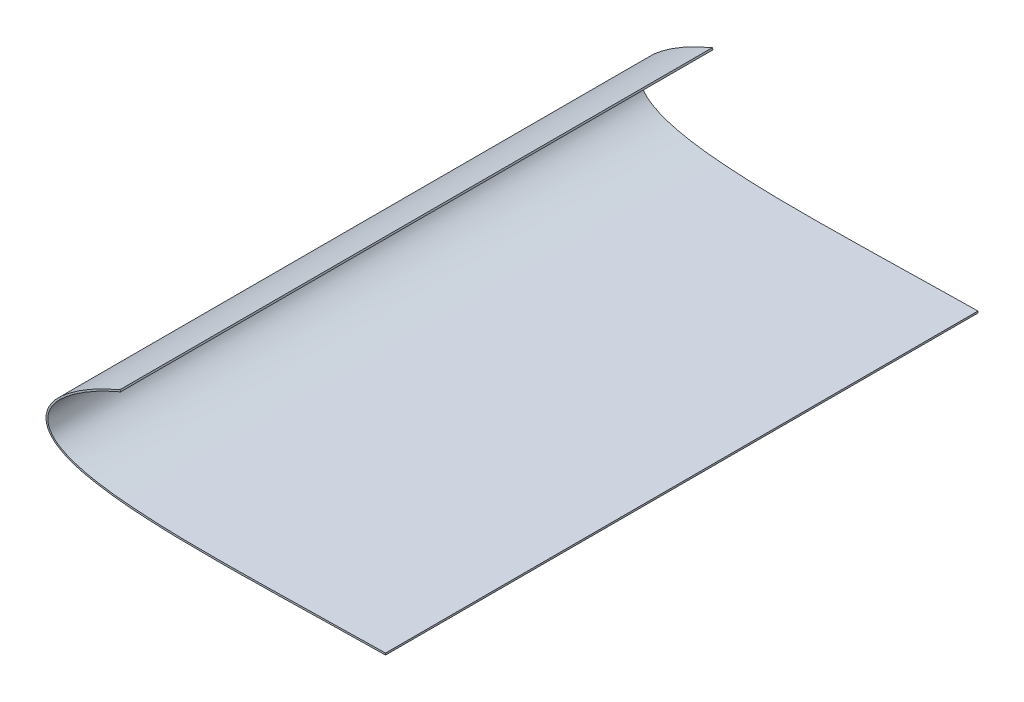
ISO-10303-21;
HEADER;
FILE_DESCRIPTION(('STEP AP214'),'2;1');
FILE_NAME('part.step','',(''),(''),'','','');
FILE_SCHEMA(('AUTOMOTIVE_DESIGN { 1 0 10303 214 1 1 1 1 }'));
ENDSEC;
DATA;
#1=APPLICATION_CONTEXT('core data for automotive mechanical design processes');
#2=APPLICATION_PROTOCOL_DEFINITION('international standard','automotive_design',2000,#1);
#3=PRODUCT_CONTEXT('',#1,'mechanical');
#4=PRODUCT('Part','Part','',(#3));
#5=PRODUCT_RELATED_PRODUCT_CATEGORY('part','',(#4));
#6=PRODUCT_DEFINITION_FORMATION('','',#4);
#7=PRODUCT_DEFINITION_CONTEXT('part definition',#1,'design');
#8=PRODUCT_DEFINITION('design','',#6,#7);
#9=PRODUCT_DEFINITION_SHAPE('','',#8);
#10=(LENGTH_UNIT() NAMED_UNIT(*) SI_UNIT(.MILLI.,.METRE.));
#11=(NAMED_UNIT(*) PLANE_ANGLE_UNIT() SI_UNIT($,.RADIAN.));
#12=(NAMED_UNIT(*) SI_UNIT($,.STERADIAN.) SOLID_ANGLE_UNIT());
#13=UNCERTAINTY_MEASURE_WITH_UNIT(LENGTH_MEASURE(1.E-05),#10,'distance_accuracy_value','');
#14=(GEOMETRIC_REPRESENTATION_CONTEXT(3) GLOBAL_UNCERTAINTY_ASSIGNED_CONTEXT((#13)) GLOBAL_UNIT_ASSIGNED_CONTEXT((#10,
#11,#12)) REPRESENTATION_CONTEXT('',''));
#15=CARTESIAN_POINT('',(0.,0.,0.));
#16=DIRECTION('',(0.,0.,1.));
#17=DIRECTION('',(1.,0.,0.));
#18=AXIS2_PLACEMENT_3D('',#15,#16,#17);
#19=CARTESIAN_POINT('',(52.279784263396,54.6368495583963,-174.625));
#20=CARTESIAN_POINT('',(51.9842375839482,54.5110568205723,-174.625));
#21=CARTESIAN_POINT('',(50.7698703349108,53.9873361103405,-174.625));
#22=CARTESIAN_POINT('',(48.7262842208841,53.0365372041149,-174.625));
#23=CARTESIAN_POINT('',(46.1985966340727,51.7856149808949,-174.625));
#24=CARTESIAN_POINT('',(43.8513955335234,50.5628357336957,-174.625));
#25=CARTESIAN_POINT('',(41.7065223147171,49.2753909988389,-174.625));
#26=CARTESIAN_POINT('',(39.733394775625,48.0292859809215,-174.625));
#27=CARTESIAN_POINT('',(37.9660150500307,46.7508633129765,-174.625));
#28=CARTESIAN_POINT('',(36.3542569420481,45.5542620285061,-174.625));
#29=CARTESIAN_POINT('',(34.9506042386984,44.3247206516308,-174.625));
#30=CARTESIAN_POINT('',(33.7310058534112,43.1375529445579,-174.625));
#31=CARTESIAN_POINT('',(32.6875400615619,41.9646967740159,-174.625));
#32=CARTESIAN_POINT('',(31.8700494946095,40.7950980760292,-174.625));
#33=CARTESIAN_POINT('',(31.2049081040977,39.6569207752362,-174.625));
#34=CARTESIAN_POINT('',(30.8086033681005,38.5196104238674,-174.625));
#35=CARTESIAN_POINT('',(30.5235691356459,37.4345389132446,-174.625));
#36=CARTESIAN_POINT('',(30.4310087825791,36.3627840788217,-174.625));
#37=CARTESIAN_POINT('',(30.615024145006,35.32934754233,-174.625));
#38=CARTESIAN_POINT('',(30.8927865257014,34.3177616701598,-174.625));
#39=CARTESIAN_POINT('',(31.4496102095806,33.3932258153343,-174.625));
#40=CARTESIAN_POINT('',(32.1506525347102,32.5234150336729,-174.625));
#41=CARTESIAN_POINT('',(32.9766589610015,31.6506119978175,-174.625));
#42=CARTESIAN_POINT('',(34.0717450313561,30.9441424330286,-174.625));
#43=CARTESIAN_POINT('',(35.2743301471047,30.2147424818531,-174.625));
#44=CARTESIAN_POINT('',(36.6606910218293,29.5585884336969,-174.625));
#45=CARTESIAN_POINT('',(38.2298639762326,28.9795874382233,-174.625));
#46=CARTESIAN_POINT('',(39.9603274946295,28.409153359317,-174.625));
#47=CARTESIAN_POINT('',(41.862111381165,27.9076892579437,-174.625));
#48=CARTESIAN_POINT('',(43.9308294935862,27.4768136073615,-174.625));
#49=CARTESIAN_POINT('',(46.1430586763678,27.0544798825399,-174.625));
#50=CARTESIAN_POINT('',(48.5261088087182,26.711860726111,-174.625));
#51=CARTESIAN_POINT('',(51.0445678607058,26.3949027035553,-174.625));
#52=CARTESIAN_POINT('',(53.7226630674446,26.06649037235,-174.625));
#53=CARTESIAN_POINT('',(56.5512320841555,25.9162004583246,-174.625));
#54=CARTESIAN_POINT('',(59.5207885191564,25.6696578391719,-174.625));
#55=CARTESIAN_POINT('',(62.6352898997253,25.564258659258,-174.625));
#56=CARTESIAN_POINT('',(65.8829117322227,25.3781107864141,-174.625));
#57=CARTESIAN_POINT('',(69.2727213948618,25.3117021246645,-174.625));
#58=CARTESIAN_POINT('',(72.7875926931949,25.2447227423576,-174.625));
#59=CARTESIAN_POINT('',(76.4410168529708,25.2177536800816,-174.625));
#60=CARTESIAN_POINT('',(80.2079561151313,25.2059255566866,-174.625));
#61=CARTESIAN_POINT('',(84.0995890603195,25.2542808010686,-174.625));
#62=CARTESIAN_POINT('',(88.093376992889,25.2344045238007,-174.625));
#63=CARTESIAN_POINT('',(92.2094832757753,25.3673234412305,-174.625));
#64=CARTESIAN_POINT('',(96.427933938967,25.3704722092847,-174.625));
#65=CARTESIAN_POINT('',(100.757397226996,25.4491366982306,-174.625));
#66=CARTESIAN_POINT('',(105.17451648858,25.5547340767129,-174.625));
#67=CARTESIAN_POINT('',(109.691566336199,25.6470871193837,-174.625));
#68=CARTESIAN_POINT('',(114.294867366389,25.7362480016773,-174.625));
#69=CARTESIAN_POINT('',(118.998236922616,25.8022193393076,-174.625));
#70=CARTESIAN_POINT('',(123.786466612625,25.9376003922086,-174.625));
#71=CARTESIAN_POINT('',(127.652050322274,25.978617474138,-174.625));
#72=CARTESIAN_POINT('',(129.916088327162,26.0062875546644,-174.625));
#73=CARTESIAN_POINT('',(130.555209424101,26.0143218854273,-174.625));
#74=B_SPLINE_CURVE_WITH_KNOTS('',3,(#19,#20,#21,#22,#23,#24,#25,#26,#27,#28,#29,#30,#31,#32,#33,
#34,#35,#36,#37,#38,#39,#40,#41,#42,#43,#44,#45,#46,#47,#48,#49,#50,#51,#52,#53,#54,#55,#56,#57,
#58,#59,#60,#61,#62,#63,#64,#65,#66,#67,#68,#69,#70,#71,#72,#73),.UNSPECIFIED.,.F.,.F.,(4,1,1,1,
1,1,1,1,1,1,1,1,1,1,1,1,1,1,1,1,1,1,1,1,1,1,1,1,1,1,1,1,1,1,1,1,1,1,1,1,1,1,1,1,1,1,1,1,1,1,1,1,
4),(14.1344292083141,14.1723678306515,14.2906368426527,14.4005642750807,14.5054914593558,
14.6030933056501,14.6959497647682,14.7810065128842,14.8606668744199,14.932933187457,
15.0011950186659,15.0616397239758,15.1179775656103,15.1695757089876,15.2167045451708,
15.2596692469617,15.3020092469619,15.3423908516848,15.383061745454,15.4251745843519,
15.4685835050936,15.5151435437538,15.5662226823522,15.6217218895538,15.681367848344,
15.7469541944843,15.8191910050454,15.8965021064469,15.9790921784904,16.0687366540585,
16.162461376517,16.2633705099003,16.3685817203289,16.4810017203293,16.59780172033,
16.7204764773092,16.848989654843,16.9819779445536,17.1208699169633,17.2642178294,
17.4134881037355,17.5657766719204,17.7238886727302,17.8851509435814,18.0521088221016,
18.2220969675706,18.3965776576198,18.5739661555559,18.7557170983324,18.9403767994038,
19.1295299278471,19.3214630182723,19.3969558554318),.UNSPECIFIED.);
#75=DIRECTION('',(0.,0.,1.));
#76=VECTOR('',#75,1.);
#77=SURFACE_OF_LINEAR_EXTRUSION('',#74,#76);
#78=CARTESIAN_POINT('',(52.279784263396,54.6368495583963,0.));
#79=CARTESIAN_POINT('',(51.9842375839482,54.5110568205723,0.));
#80=CARTESIAN_POINT('',(50.7698703349108,53.9873361103405,0.));
#81=CARTESIAN_POINT('',(48.7262842208841,53.0365372041149,0.));
#82=CARTESIAN_POINT('',(46.1985966340727,51.7856149808949,0.));
#83=CARTESIAN_POINT('',(43.8513955335234,50.5628357336957,0.));
#84=CARTESIAN_POINT('',(41.7065223147171,49.2753909988389,0.));
#85=CARTESIAN_POINT('',(39.733394775625,48.0292859809215,0.));
#86=CARTESIAN_POINT('',(37.9660150500307,46.7508633129765,0.));
#87=CARTESIAN_POINT('',(36.3542569420481,45.5542620285061,0.));
#88=CARTESIAN_POINT('',(34.9506042386984,44.3247206516308,0.));
#89=CARTESIAN_POINT('',(33.7310058534112,43.1375529445579,0.));
#90=CARTESIAN_POINT('',(32.6875400615619,41.9646967740159,0.));
#91=CARTESIAN_POINT('',(31.8700494946095,40.7950980760292,0.));
#92=CARTESIAN_POINT('',(31.2049081040977,39.6569207752362,0.));
#93=CARTESIAN_POINT('',(30.8086033681005,38.5196104238674,0.));
#94=CARTESIAN_POINT('',(30.5235691356459,37.4345389132446,0.));
#95=CARTESIAN_POINT('',(30.4310087825791,36.3627840788217,0.));
#96=CARTESIAN_POINT('',(30.615024145006,35.32934754233,0.));
#97=CARTESIAN_POINT('',(30.8927865257014,34.3177616701598,0.));
#98=CARTESIAN_POINT('',(31.4496102095806,33.3932258153343,0.));
#99=CARTESIAN_POINT('',(32.1506525347102,32.5234150336729,0.));
#100=CARTESIAN_POINT('',(32.9766589610015,31.6506119978175,0.));
#101=CARTESIAN_POINT('',(34.0717450313561,30.9441424330286,0.));
#102=CARTESIAN_POINT('',(35.2743301471047,30.2147424818531,0.));
#103=CARTESIAN_POINT('',(36.6606910218293,29.5585884336969,0.));
#104=CARTESIAN_POINT('',(38.2298639762326,28.9795874382233,0.));
#105=CARTESIAN_POINT('',(39.9603274946295,28.409153359317,0.));
#106=CARTESIAN_POINT('',(41.862111381165,27.9076892579437,0.));
#107=CARTESIAN_POINT('',(43.9308294935862,27.4768136073615,0.));
#108=CARTESIAN_POINT('',(46.1430586763678,27.0544798825399,0.));
#109=CARTESIAN_POINT('',(48.5261088087182,26.711860726111,0.));
#110=CARTESIAN_POINT('',(51.0445678607058,26.3949027035553,0.));
#111=CARTESIAN_POINT('',(53.7226630674446,26.06649037235,0.));
#112=CARTESIAN_POINT('',(56.5512320841555,25.9162004583246,0.));
#113=CARTESIAN_POINT('',(59.5207885191564,25.6696578391719,0.));
#114=CARTESIAN_POINT('',(62.6352898997253,25.564258659258,0.));
#115=CARTESIAN_POINT('',(65.8829117322227,25.3781107864141,0.));
#116=CARTESIAN_POINT('',(69.2727213948618,25.3117021246645,0.));
#117=CARTESIAN_POINT('',(72.7875926931949,25.2447227423576,0.));
#118=CARTESIAN_POINT('',(76.4410168529708,25.2177536800816,0.));
#119=CARTESIAN_POINT('',(80.2079561151313,25.2059255566866,0.));
#120=CARTESIAN_POINT('',(84.0995890603195,25.2542808010686,0.));
#121=CARTESIAN_POINT('',(88.093376992889,25.2344045238007,0.));
#122=CARTESIAN_POINT('',(92.2094832757753,25.3673234412305,0.));
#123=CARTESIAN_POINT('',(96.427933938967,25.3704722092847,0.));
#124=CARTESIAN_POINT('',(100.757397226996,25.4491366982306,0.));
#125=CARTESIAN_POINT('',(105.17451648858,25.5547340767129,0.));
#126=CARTESIAN_POINT('',(109.691566336199,25.6470871193837,0.));
#127=CARTESIAN_POINT('',(114.294867366389,25.7362480016773,0.));
#128=CARTESIAN_POINT('',(118.998236922616,25.8022193393076,0.));
#129=CARTESIAN_POINT('',(123.786466612625,25.9376003922086,0.));
#130=CARTESIAN_POINT('',(127.652050322274,25.978617474138,0.));
#131=CARTESIAN_POINT('',(129.916088327162,26.0062875546644,0.));
#132=CARTESIAN_POINT('',(130.555209424101,26.0143218854273,0.));
#133=B_SPLINE_CURVE_WITH_KNOTS('',3,(#78,#79,#80,#81,#82,#83,#84,#85,#86,#87,#88,#89,#90,#91,
#92,#93,#94,#95,#96,#97,#98,#99,#100,#101,#102,#103,#104,#105,#106,#107,#108,#109,#110,#111,
#112,#113,#114,#115,#116,#117,#118,#119,#120,#121,#122,#123,#124,#125,#126,#127,#128,#129,#130,
#131,#132),.UNSPECIFIED.,.F.,.F.,(4,1,1,1,1,1,1,1,1,1,1,1,1,1,1,1,1,1,1,1,1,1,1,1,1,1,1,1,1,1,1,
1,1,1,1,1,1,1,1,1,1,1,1,1,1,1,1,1,1,1,1,1,4),(14.1344292083141,14.1723678306515,
14.2906368426527,14.4005642750807,14.5054914593558,14.6030933056501,14.6959497647682,
14.7810065128842,14.8606668744199,14.932933187457,15.0011950186659,15.0616397239758,
15.1179775656103,15.1695757089876,15.2167045451708,15.2596692469617,15.3020092469619,
15.3423908516848,15.383061745454,15.4251745843519,15.4685835050936,15.5151435437538,
15.5662226823522,15.6217218895538,15.681367848344,15.7469541944843,15.8191910050454,
15.8965021064469,15.9790921784904,16.0687366540585,16.162461376517,16.2633705099003,
16.3685817203289,16.4810017203293,16.59780172033,16.7204764773092,16.848989654843,
16.9819779445536,17.1208699169633,17.2642178294,17.4134881037355,17.5657766719204,
17.7238886727302,17.8851509435814,18.0521088221016,18.2220969675706,18.3965776576198,
18.5739661555559,18.7557170983324,18.9403767994038,19.1295299278471,19.3214630182723,
19.3969558554318),.UNSPECIFIED.);
#134=CARTESIAN_POINT('',(52.279784263396,54.6368495583963,0.));
#135=VERTEX_POINT('',#134);
#136=CARTESIAN_POINT('',(130.555209424101,26.0143218854273,0.));
#137=VERTEX_POINT('',#136);
#138=EDGE_CURVE('E119',#135,#137,#133,.T.);
#139=ORIENTED_EDGE('',*,*,#138,.F.);
#140=DIRECTION('',(0.,0.,1.));
#141=VECTOR('',#140,1.);
#142=CARTESIAN_POINT('',(52.279784263396,54.6368495583963,-174.625));
#143=LINE('',#142,#141);
#144=CARTESIAN_POINT('',(52.279784263396,54.6368495583963,-174.625));
#145=VERTEX_POINT('',#144);
#146=EDGE_CURVE('E120',#145,#135,#143,.T.);
#147=ORIENTED_EDGE('',*,*,#146,.F.);
#148=CARTESIAN_POINT('',(130.555209424101,26.0143218854273,-174.625));
#149=VERTEX_POINT('',#148);
#150=EDGE_CURVE('E92',#145,#149,#74,.T.);
#151=ORIENTED_EDGE('',*,*,#150,.T.);
#152=DIRECTION('',(0.,0.,1.));
#153=VECTOR('',#152,1.);
#154=CARTESIAN_POINT('',(130.555209424101,26.0143218854273,-174.625));
#155=LINE('',#154,#153);
#156=EDGE_CURVE('E11',#149,#137,#155,.T.);
#157=ORIENTED_EDGE('',*,*,#156,.T.);
#158=EDGE_LOOP('',(#139,#147,#151,#157));
#159=FACE_BOUND('',#158,.T.);
#160=ADVANCED_FACE('F34',(#159),#77,.T.);
#161=CARTESIAN_POINT('',(130.548667937939,26.5346890341615,-174.625));
#162=DIRECTION('',(-0.999920995533172,-0.0125699121695554,0.));
#163=DIRECTION('',(0.0125699121695555,-0.999920995533172,0.));
#164=AXIS2_PLACEMENT_3D('',#161,#162,#163);
#165=PLANE('',#164);
#166=DIRECTION('',(-0.0125699121695554,0.999920995533172,0.));
#167=VECTOR('',#166,1.);
#168=CARTESIAN_POINT('',(130.548667937939,26.5346890341615,0.));
#169=LINE('',#168,#167);
#170=CARTESIAN_POINT('',(130.548667937939,26.5346890341615,0.));
#171=VERTEX_POINT('',#170);
#172=EDGE_CURVE('E121',#137,#171,#169,.T.);
#173=ORIENTED_EDGE('',*,*,#172,.F.);
#174=ORIENTED_EDGE('',*,*,#156,.F.);
#175=DIRECTION('',(-0.0125699121695554,0.999920995533172,0.));
#176=VECTOR('',#175,1.);
#177=CARTESIAN_POINT('',(130.548667937939,26.5346890341615,-174.625));
#178=LINE('',#177,#176);
#179=CARTESIAN_POINT('',(130.548667937939,26.5346890341615,-174.625));
#180=VERTEX_POINT('',#179);
#181=EDGE_CURVE('E76',#149,#180,#178,.T.);
#182=ORIENTED_EDGE('',*,*,#181,.T.);
#183=DIRECTION('',(0.,0.,1.));
#184=VECTOR('',#183,1.);
#185=CARTESIAN_POINT('',(130.548667937939,26.5346890341615,-174.625));
#186=LINE('',#185,#184);
#187=EDGE_CURVE('E43',#180,#171,#186,.T.);
#188=ORIENTED_EDGE('',*,*,#187,.T.);
#189=EDGE_LOOP('',(#173,#174,#182,#188));
#190=FACE_BOUND('',#189,.T.);
#191=ADVANCED_FACE('F90',(#190),#165,.F.);
#192=CARTESIAN_POINT('',(130.548667937939,26.5346890341615,-174.625));
#193=CARTESIAN_POINT('',(124.555343756834,26.4491026396697,-174.625));
#194=CARTESIAN_POINT('',(118.563284111257,26.3143159513226,-174.625));
#195=CARTESIAN_POINT('',(102.663997770162,26.0308132515019,-174.625));
#196=CARTESIAN_POINT('',(92.7642170680979,25.8004249943056,-174.625));
#197=CARTESIAN_POINT('',(77.9969063518174,25.7164614683827,-174.625));
#198=CARTESIAN_POINT('',(73.1544000856876,25.7277180879495,-174.625));
#199=CARTESIAN_POINT('',(63.4698219147655,25.9577443343307,-174.625));
#200=CARTESIAN_POINT('',(58.6332063621148,26.2110915671319,-174.625));
#201=CARTESIAN_POINT('',(51.4046880593991,26.8525814791273,-174.625));
#202=CARTESIAN_POINT('',(49.0055614718312,27.1183583047564,-174.625));
#203=CARTESIAN_POINT('',(44.2531218048478,27.8939248842433,-174.625));
#204=CARTESIAN_POINT('',(41.8889325759947,28.3539185666942,-174.625));
#205=CARTESIAN_POINT('',(38.5092631099543,29.4115926421441,-174.625));
#206=CARTESIAN_POINT('',(37.4227007969777,29.7823005654821,-174.625));
#207=CARTESIAN_POINT('',(35.3858591876671,30.721401098096,-174.625));
#208=CARTESIAN_POINT('',(34.3648285070924,31.2789602327156,-174.625));
#209=CARTESIAN_POINT('',(32.4947462546347,32.7613334870106,-174.625));
#210=CARTESIAN_POINT('',(31.6368907574047,33.8105567726051,-174.625));
#211=CARTESIAN_POINT('',(30.8417084343807,36.1863154881374,-174.625));
#212=CARTESIAN_POINT('',(30.9740163157737,37.4872010536399,-174.625));
#213=CARTESIAN_POINT('',(32.1505911551316,40.6939371356345,-174.625));
#214=CARTESIAN_POINT('',(33.6489329297031,42.4217978213159,-174.625));
#215=CARTESIAN_POINT('',(37.2937741895299,45.7686663906626,-174.625));
#216=CARTESIAN_POINT('',(39.569261895129,47.3620885973542,-174.625));
#217=CARTESIAN_POINT('',(45.1489216631899,50.7908001205631,-174.625));
#218=CARTESIAN_POINT('',(48.5985134973385,52.4662096211677,-174.625));
#219=CARTESIAN_POINT('',(52.2115751343648,54.0523162100325,-174.625));
#220=CARTESIAN_POINT('',(52.3312267033242,54.1046027201561,-174.625));
#221=CARTESIAN_POINT('',(52.4509665908119,54.1566903924833,-174.625));
#222=B_SPLINE_CURVE_WITH_KNOTS('',3,(#192,#193,#194,#195,#196,#197,#198,#199,#200,#201,#202,
#203,#204,#205,#206,#207,#208,#209,#210,#211,#212,#213,#214,#215,#216,#217,#218,#219,#220,#221),
.UNSPECIFIED.,.F.,.F.,(4,2,2,2,2,2,2,2,2,2,2,2,2,2,4),(14.135708649313,14.8434402693259,
16.0140470282882,16.5870564413242,17.1600658543601,17.446570560878,17.733075267396,
17.8698354280187,18.0065955886415,18.1697632211686,18.3329308536956,18.6002796477227,
18.9285117511339,19.3814841253363,19.3969867417204),.UNSPECIFIED.);
#223=DIRECTION('',(0.,0.,1.));
#224=VECTOR('',#223,1.);
#225=SURFACE_OF_LINEAR_EXTRUSION('',#222,#224);
#226=CARTESIAN_POINT('',(130.548667937939,26.5346890341615,0.));
#227=CARTESIAN_POINT('',(124.555343756834,26.4491026396697,0.));
#228=CARTESIAN_POINT('',(118.563284111257,26.3143159513226,0.));
#229=CARTESIAN_POINT('',(102.663997770162,26.0308132515019,0.));
#230=CARTESIAN_POINT('',(92.7642170680979,25.8004249943056,0.));
#231=CARTESIAN_POINT('',(77.9969063518174,25.7164614683827,0.));
#232=CARTESIAN_POINT('',(73.1544000856876,25.7277180879495,0.));
#233=CARTESIAN_POINT('',(63.4698219147655,25.9577443343307,0.));
#234=CARTESIAN_POINT('',(58.6332063621148,26.2110915671319,0.));
#235=CARTESIAN_POINT('',(51.4046880593991,26.8525814791273,0.));
#236=CARTESIAN_POINT('',(49.0055614718312,27.1183583047564,0.));
#237=CARTESIAN_POINT('',(44.2531218048478,27.8939248842433,0.));
#238=CARTESIAN_POINT('',(41.8889325759947,28.3539185666942,0.));
#239=CARTESIAN_POINT('',(38.5092631099543,29.4115926421441,0.));
#240=CARTESIAN_POINT('',(37.4227007969777,29.7823005654821,0.));
#241=CARTESIAN_POINT('',(35.3858591876671,30.721401098096,0.));
#242=CARTESIAN_POINT('',(34.3648285070924,31.2789602327156,0.));
#243=CARTESIAN_POINT('',(32.4947462546347,32.7613334870106,0.));
#244=CARTESIAN_POINT('',(31.6368907574047,33.8105567726051,0.));
#245=CARTESIAN_POINT('',(30.8417084343807,36.1863154881374,0.));
#246=CARTESIAN_POINT('',(30.9740163157737,37.4872010536399,0.));
#247=CARTESIAN_POINT('',(32.1505911551316,40.6939371356345,0.));
#248=CARTESIAN_POINT('',(33.6489329297031,42.4217978213159,0.));
#249=CARTESIAN_POINT('',(37.2937741895299,45.7686663906626,0.));
#250=CARTESIAN_POINT('',(39.569261895129,47.3620885973542,0.));
#251=CARTESIAN_POINT('',(45.1489216631899,50.7908001205631,0.));
#252=CARTESIAN_POINT('',(48.5985134973385,52.4662096211677,0.));
#253=CARTESIAN_POINT('',(52.2115751343648,54.0523162100325,0.));
#254=CARTESIAN_POINT('',(52.3312267033242,54.1046027201561,0.));
#255=CARTESIAN_POINT('',(52.4509665908119,54.1566903924833,0.));
#256=B_SPLINE_CURVE_WITH_KNOTS('',3,(#226,#227,#228,#229,#230,#231,#232,#233,#234,#235,#236,
#237,#238,#239,#240,#241,#242,#243,#244,#245,#246,#247,#248,#249,#250,#251,#252,#253,#254,#255),
.UNSPECIFIED.,.F.,.F.,(4,2,2,2,2,2,2,2,2,2,2,2,2,2,4),(14.135708649313,14.8434402693259,
16.0140470282882,16.5870564413242,17.1600658543601,17.446570560878,17.733075267396,
17.8698354280187,18.0065955886415,18.1697632211686,18.3329308536956,18.6002796477227,
18.9285117511339,19.3814841253363,19.3969867417204),.UNSPECIFIED.);
#257=CARTESIAN_POINT('',(52.4509665908119,54.1566903924833,0.));
#258=VERTEX_POINT('',#257);
#259=EDGE_CURVE('E86',#171,#258,#256,.T.);
#260=ORIENTED_EDGE('',*,*,#259,.F.);
#261=ORIENTED_EDGE('',*,*,#187,.F.);
#262=CARTESIAN_POINT('',(52.4509665908119,54.1566903924833,-174.625));
#263=VERTEX_POINT('',#262);
#264=EDGE_CURVE('E79',#180,#263,#222,.T.);
#265=ORIENTED_EDGE('',*,*,#264,.T.);
#266=DIRECTION('',(0.,0.,1.));
#267=VECTOR('',#266,1.);
#268=CARTESIAN_POINT('',(52.4509665908119,54.1566903924833,-174.625));
#269=LINE('',#268,#267);
#270=EDGE_CURVE('E89',#263,#258,#269,.T.);
#271=ORIENTED_EDGE('',*,*,#270,.T.);
#272=EDGE_LOOP('',(#260,#261,#265,#271));
#273=FACE_BOUND('',#272,.T.);
#274=ADVANCED_FACE('F85',(#273),#225,.T.);
#275=CARTESIAN_POINT('',(52.4509665908119,54.1566903924833,-174.625));
#276=DIRECTION('',(-0.941930089566212,-0.335809032591125,0.));
#277=DIRECTION('',(0.335809032591125,-0.941930089566212,0.));
#278=AXIS2_PLACEMENT_3D('',#275,#276,#277);
#279=PLANE('',#278);
#280=DIRECTION('',(-0.335809032591125,0.941930089566213,0.));
#281=VECTOR('',#280,1.);
#282=CARTESIAN_POINT('',(52.4509665908119,54.1566903924833,0.));
#283=LINE('',#282,#281);
#284=EDGE_CURVE('E65',#258,#135,#283,.T.);
#285=ORIENTED_EDGE('',*,*,#284,.F.);
#286=ORIENTED_EDGE('',*,*,#270,.F.);
#287=DIRECTION('',(-0.335809032591125,0.941930089566213,0.));
#288=VECTOR('',#287,1.);
#289=CARTESIAN_POINT('',(52.4509665908119,54.1566903924833,-174.625));
#290=LINE('',#289,#288);
#291=EDGE_CURVE('E51',#263,#145,#290,.T.);
#292=ORIENTED_EDGE('',*,*,#291,.T.);
#293=ORIENTED_EDGE('',*,*,#146,.T.);
#294=EDGE_LOOP('',(#285,#286,#292,#293));
#295=FACE_BOUND('',#294,.T.);
#296=ADVANCED_FACE('F108',(#295),#279,.F.);
#297=CARTESIAN_POINT('',(63.7324862428104,25.4986905160754,-174.625));
#298=DIRECTION('',(0.,0.,1.));
#299=DIRECTION('',(-1.,0.,0.));
#300=AXIS2_PLACEMENT_3D('',#297,#298,#299);
#301=PLANE('',#300);
#302=ORIENTED_EDGE('',*,*,#150,.F.);
#303=ORIENTED_EDGE('',*,*,#291,.F.);
#304=ORIENTED_EDGE('',*,*,#264,.F.);
#305=ORIENTED_EDGE('',*,*,#181,.F.);
#306=EDGE_LOOP('',(#302,#303,#304,#305));
#307=FACE_BOUND('',#306,.T.);
#308=ADVANCED_FACE('F81',(#307),#301,.F.);
#309=CARTESIAN_POINT('',(63.7324862428104,25.4986905160754,0.));
#310=DIRECTION('',(0.,0.,1.));
#311=DIRECTION('',(-1.,0.,0.));
#312=AXIS2_PLACEMENT_3D('',#309,#310,#311);
#313=PLANE('',#312);
#314=ORIENTED_EDGE('',*,*,#138,.T.);
#315=ORIENTED_EDGE('',*,*,#172,.T.);
#316=ORIENTED_EDGE('',*,*,#259,.T.);
#317=ORIENTED_EDGE('',*,*,#284,.T.);
#318=EDGE_LOOP('',(#314,#315,#316,#317));
#319=FACE_BOUND('',#318,.T.);
#320=ADVANCED_FACE('F137',(#319),#313,.T.);
#321=CLOSED_SHELL('',(#160,#191,#274,#296,#308,#320));
#322=MANIFOLD_SOLID_BREP('B2',#321);
#323=ADVANCED_BREP_SHAPE_REPRESENTATION('',(#18,#322),#14);
#324=SHAPE_DEFINITION_REPRESENTATION(#9,#323);
ENDSEC;
END-ISO-10303-21;
